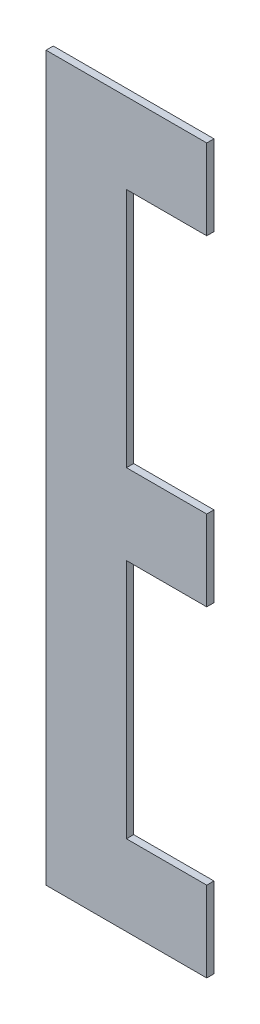
ISO-10303-21;
HEADER;
FILE_DESCRIPTION(('STEP AP214'),'2;1');
FILE_NAME('part.step','',(''),(''),'','','');
FILE_SCHEMA(('AUTOMOTIVE_DESIGN { 1 0 10303 214 1 1 1 1 }'));
ENDSEC;
DATA;
#1=APPLICATION_CONTEXT('core data for automotive mechanical design processes');
#2=APPLICATION_PROTOCOL_DEFINITION('international standard','automotive_design',2000,#1);
#3=PRODUCT_CONTEXT('',#1,'mechanical');
#4=PRODUCT('Part','Part','',(#3));
#5=PRODUCT_RELATED_PRODUCT_CATEGORY('part','',(#4));
#6=PRODUCT_DEFINITION_FORMATION('','',#4);
#7=PRODUCT_DEFINITION_CONTEXT('part definition',#1,'design');
#8=PRODUCT_DEFINITION('design','',#6,#7);
#9=PRODUCT_DEFINITION_SHAPE('','',#8);
#10=(LENGTH_UNIT() NAMED_UNIT(*) SI_UNIT(.MILLI.,.METRE.));
#11=(NAMED_UNIT(*) PLANE_ANGLE_UNIT() SI_UNIT($,.RADIAN.));
#12=(NAMED_UNIT(*) SI_UNIT($,.STERADIAN.) SOLID_ANGLE_UNIT());
#13=UNCERTAINTY_MEASURE_WITH_UNIT(LENGTH_MEASURE(1.E-05),#10,'distance_accuracy_value','');
#14=(GEOMETRIC_REPRESENTATION_CONTEXT(3) GLOBAL_UNCERTAINTY_ASSIGNED_CONTEXT((#13)) GLOBAL_UNIT_ASSIGNED_CONTEXT((#10,
#11,#12)) REPRESENTATION_CONTEXT('',''));
#15=CARTESIAN_POINT('',(0.,0.,0.));
#16=DIRECTION('',(0.,0.,1.));
#17=DIRECTION('',(1.,0.,0.));
#18=AXIS2_PLACEMENT_3D('',#15,#16,#17);
#19=CARTESIAN_POINT('',(0.,0.,0.05));
#20=DIRECTION('',(0.,0.,1.));
#21=DIRECTION('',(1.,0.,0.));
#22=AXIS2_PLACEMENT_3D('',#19,#20,#21);
#23=PLANE('',#22);
#24=DIRECTION('',(1.,0.,0.));
#25=VECTOR('',#24,1.);
#26=CARTESIAN_POINT('',(0.,2.5,0.05));
#27=LINE('',#26,#25);
#28=CARTESIAN_POINT('',(-1.389,2.5,0.05));
#29=VERTEX_POINT('',#28);
#30=CARTESIAN_POINT('',(-2.5,2.5,0.05));
#31=VERTEX_POINT('',#30);
#32=EDGE_CURVE('E141',#29,#31,#27,.F.);
#33=ORIENTED_EDGE('',*,*,#32,.T.);
#34=DIRECTION('',(0.,1.,0.));
#35=VECTOR('',#34,1.);
#36=CARTESIAN_POINT('',(-2.5,2.5,0.05));
#37=LINE('',#36,#35);
#38=CARTESIAN_POINT('',(-2.5,-2.5,0.05));
#39=VERTEX_POINT('',#38);
#40=EDGE_CURVE('E108',#39,#31,#37,.T.);
#41=ORIENTED_EDGE('',*,*,#40,.F.);
#42=DIRECTION('',(1.,0.,0.));
#43=VECTOR('',#42,1.);
#44=CARTESIAN_POINT('',(0.,-2.5,0.05));
#45=LINE('',#44,#43);
#46=CARTESIAN_POINT('',(-1.389,-2.5,0.05));
#47=VERTEX_POINT('',#46);
#48=EDGE_CURVE('E20',#39,#47,#45,.T.);
#49=ORIENTED_EDGE('',*,*,#48,.T.);
#50=DIRECTION('',(0.,1.,0.));
#51=VECTOR('',#50,1.);
#52=CARTESIAN_POINT('',(-1.389,0.,0.05));
#53=LINE('',#52,#51);
#54=CARTESIAN_POINT('',(-1.389,-1.944,0.05));
#55=VERTEX_POINT('',#54);
#56=EDGE_CURVE('E103',#47,#55,#53,.T.);
#57=ORIENTED_EDGE('',*,*,#56,.T.);
#58=DIRECTION('',(1.,0.,0.));
#59=VECTOR('',#58,1.);
#60=CARTESIAN_POINT('',(0.,-1.944,0.05));
#61=LINE('',#60,#59);
#62=CARTESIAN_POINT('',(-1.944,-1.944,0.05));
#63=VERTEX_POINT('',#62);
#64=EDGE_CURVE('E124',#55,#63,#61,.F.);
#65=ORIENTED_EDGE('',*,*,#64,.T.);
#66=DIRECTION('',(0.,1.,0.));
#67=VECTOR('',#66,1.);
#68=CARTESIAN_POINT('',(-1.944,0.,0.05));
#69=LINE('',#68,#67);
#70=CARTESIAN_POINT('',(-1.944,-0.278,0.05));
#71=VERTEX_POINT('',#70);
#72=EDGE_CURVE('E125',#63,#71,#69,.T.);
#73=ORIENTED_EDGE('',*,*,#72,.T.);
#74=DIRECTION('',(1.,0.,0.));
#75=VECTOR('',#74,1.);
#76=CARTESIAN_POINT('',(0.,-0.278,0.05));
#77=LINE('',#76,#75);
#78=CARTESIAN_POINT('',(-1.389,-0.278,0.05));
#79=VERTEX_POINT('',#78);
#80=EDGE_CURVE('E129',#71,#79,#77,.T.);
#81=ORIENTED_EDGE('',*,*,#80,.T.);
#82=DIRECTION('',(0.,1.,0.));
#83=VECTOR('',#82,1.);
#84=CARTESIAN_POINT('',(-1.389,0.,0.05));
#85=LINE('',#84,#83);
#86=CARTESIAN_POINT('',(-1.389,0.278,0.05));
#87=VERTEX_POINT('',#86);
#88=EDGE_CURVE('E131',#79,#87,#85,.T.);
#89=ORIENTED_EDGE('',*,*,#88,.T.);
#90=DIRECTION('',(1.,0.,0.));
#91=VECTOR('',#90,1.);
#92=CARTESIAN_POINT('',(0.,0.278,0.05));
#93=LINE('',#92,#91);
#94=CARTESIAN_POINT('',(-1.944,0.278,0.05));
#95=VERTEX_POINT('',#94);
#96=EDGE_CURVE('E133',#87,#95,#93,.F.);
#97=ORIENTED_EDGE('',*,*,#96,.T.);
#98=DIRECTION('',(0.,1.,0.));
#99=VECTOR('',#98,1.);
#100=CARTESIAN_POINT('',(-1.944,0.,0.05));
#101=LINE('',#100,#99);
#102=CARTESIAN_POINT('',(-1.944,1.944,0.05));
#103=VERTEX_POINT('',#102);
#104=EDGE_CURVE('E135',#95,#103,#101,.T.);
#105=ORIENTED_EDGE('',*,*,#104,.T.);
#106=DIRECTION('',(1.,0.,0.));
#107=VECTOR('',#106,1.);
#108=CARTESIAN_POINT('',(0.,1.944,0.05));
#109=LINE('',#108,#107);
#110=CARTESIAN_POINT('',(-1.389,1.944,0.05));
#111=VERTEX_POINT('',#110);
#112=EDGE_CURVE('E137',#103,#111,#109,.T.);
#113=ORIENTED_EDGE('',*,*,#112,.T.);
#114=DIRECTION('',(0.,1.,0.));
#115=VECTOR('',#114,1.);
#116=CARTESIAN_POINT('',(-1.389,0.,0.05));
#117=LINE('',#116,#115);
#118=EDGE_CURVE('E139',#111,#29,#117,.T.);
#119=ORIENTED_EDGE('',*,*,#118,.T.);
#120=EDGE_LOOP('',(#33,#41,#49,#57,#65,#73,#81,#89,#97,#105,#113,#119));
#121=FACE_BOUND('',#120,.T.);
#122=ADVANCED_FACE('F17',(#121),#23,.T.);
#123=CARTESIAN_POINT('',(-2.5,2.5,0.));
#124=DIRECTION('',(-1.,0.,0.));
#125=DIRECTION('',(0.,0.,1.));
#126=AXIS2_PLACEMENT_3D('',#123,#124,#125);
#127=PLANE('',#126);
#128=DIRECTION('',(0.,0.,1.));
#129=VECTOR('',#128,1.);
#130=CARTESIAN_POINT('',(-2.5,2.5,0.));
#131=LINE('',#130,#129);
#132=CARTESIAN_POINT('',(-2.5,2.5,0.));
#133=VERTEX_POINT('',#132);
#134=EDGE_CURVE('E160',#133,#31,#131,.T.);
#135=ORIENTED_EDGE('',*,*,#134,.F.);
#136=DIRECTION('',(0.,1.,0.));
#137=VECTOR('',#136,1.);
#138=CARTESIAN_POINT('',(-2.5,0.,0.));
#139=LINE('',#138,#137);
#140=CARTESIAN_POINT('',(-2.5,-2.5,0.));
#141=VERTEX_POINT('',#140);
#142=EDGE_CURVE('E164',#133,#141,#139,.F.);
#143=ORIENTED_EDGE('',*,*,#142,.T.);
#144=DIRECTION('',(0.,0.,-1.));
#145=VECTOR('',#144,1.);
#146=CARTESIAN_POINT('',(-2.5,-2.5,0.));
#147=LINE('',#146,#145);
#148=EDGE_CURVE('E120',#39,#141,#147,.T.);
#149=ORIENTED_EDGE('',*,*,#148,.F.);
#150=ORIENTED_EDGE('',*,*,#40,.T.);
#151=EDGE_LOOP('',(#135,#143,#149,#150));
#152=FACE_BOUND('',#151,.T.);
#153=ADVANCED_FACE('F234',(#152),#127,.T.);
#154=CARTESIAN_POINT('',(-2.5,-2.5,0.));
#155=DIRECTION('',(0.,-1.,0.));
#156=DIRECTION('',(0.,0.,-1.));
#157=AXIS2_PLACEMENT_3D('',#154,#155,#156);
#158=PLANE('',#157);
#159=ORIENTED_EDGE('',*,*,#148,.T.);
#160=DIRECTION('',(1.,0.,0.));
#161=VECTOR('',#160,1.);
#162=CARTESIAN_POINT('',(0.,-2.5,0.));
#163=LINE('',#162,#161);
#164=CARTESIAN_POINT('',(-1.389,-2.5,0.));
#165=VERTEX_POINT('',#164);
#166=EDGE_CURVE('E115',#141,#165,#163,.T.);
#167=ORIENTED_EDGE('',*,*,#166,.T.);
#168=DIRECTION('',(0.,0.,-1.));
#169=VECTOR('',#168,1.);
#170=CARTESIAN_POINT('',(-1.389,-2.5,0.));
#171=LINE('',#170,#169);
#172=EDGE_CURVE('E112',#47,#165,#171,.T.);
#173=ORIENTED_EDGE('',*,*,#172,.F.);
#174=ORIENTED_EDGE('',*,*,#48,.F.);
#175=EDGE_LOOP('',(#159,#167,#173,#174));
#176=FACE_BOUND('',#175,.T.);
#177=ADVANCED_FACE('F113',(#176),#158,.T.);
#178=CARTESIAN_POINT('',(-1.389,-2.5,0.));
#179=DIRECTION('',(1.,0.,0.));
#180=DIRECTION('',(0.,0.,-1.));
#181=AXIS2_PLACEMENT_3D('',#178,#179,#180);
#182=PLANE('',#181);
#183=ORIENTED_EDGE('',*,*,#172,.T.);
#184=DIRECTION('',(0.,1.,0.));
#185=VECTOR('',#184,1.);
#186=CARTESIAN_POINT('',(-1.389,0.,0.));
#187=LINE('',#186,#185);
#188=CARTESIAN_POINT('',(-1.389,-1.944,0.));
#189=VERTEX_POINT('',#188);
#190=EDGE_CURVE('E168',#165,#189,#187,.T.);
#191=ORIENTED_EDGE('',*,*,#190,.T.);
#192=DIRECTION('',(0.,0.,1.));
#193=VECTOR('',#192,1.);
#194=CARTESIAN_POINT('',(-1.389,-1.944,0.));
#195=LINE('',#194,#193);
#196=EDGE_CURVE('E119',#55,#189,#195,.F.);
#197=ORIENTED_EDGE('',*,*,#196,.F.);
#198=ORIENTED_EDGE('',*,*,#56,.F.);
#199=EDGE_LOOP('',(#183,#191,#197,#198));
#200=FACE_BOUND('',#199,.T.);
#201=ADVANCED_FACE('F122',(#200),#182,.T.);
#202=CARTESIAN_POINT('',(-1.389,-1.944,0.));
#203=DIRECTION('',(0.,1.,0.));
#204=DIRECTION('',(0.,0.,1.));
#205=AXIS2_PLACEMENT_3D('',#202,#203,#204);
#206=PLANE('',#205);
#207=ORIENTED_EDGE('',*,*,#196,.T.);
#208=DIRECTION('',(1.,0.,0.));
#209=VECTOR('',#208,1.);
#210=CARTESIAN_POINT('',(0.,-1.944,0.));
#211=LINE('',#210,#209);
#212=CARTESIAN_POINT('',(-1.944,-1.944,0.));
#213=VERTEX_POINT('',#212);
#214=EDGE_CURVE('E170',#189,#213,#211,.F.);
#215=ORIENTED_EDGE('',*,*,#214,.T.);
#216=DIRECTION('',(0.,0.,-1.));
#217=VECTOR('',#216,1.);
#218=CARTESIAN_POINT('',(-1.944,-1.944,0.));
#219=LINE('',#218,#217);
#220=EDGE_CURVE('E146',#63,#213,#219,.T.);
#221=ORIENTED_EDGE('',*,*,#220,.F.);
#222=ORIENTED_EDGE('',*,*,#64,.F.);
#223=EDGE_LOOP('',(#207,#215,#221,#222));
#224=FACE_BOUND('',#223,.T.);
#225=ADVANCED_FACE('F231',(#224),#206,.T.);
#226=CARTESIAN_POINT('',(-1.944,-1.944,0.));
#227=DIRECTION('',(1.,0.,0.));
#228=DIRECTION('',(0.,0.,-1.));
#229=AXIS2_PLACEMENT_3D('',#226,#227,#228);
#230=PLANE('',#229);
#231=ORIENTED_EDGE('',*,*,#220,.T.);
#232=DIRECTION('',(0.,1.,0.));
#233=VECTOR('',#232,1.);
#234=CARTESIAN_POINT('',(-1.944,0.,0.));
#235=LINE('',#234,#233);
#236=CARTESIAN_POINT('',(-1.944,-0.278,0.));
#237=VERTEX_POINT('',#236);
#238=EDGE_CURVE('E173',#213,#237,#235,.T.);
#239=ORIENTED_EDGE('',*,*,#238,.T.);
#240=DIRECTION('',(0.,0.,-1.));
#241=VECTOR('',#240,1.);
#242=CARTESIAN_POINT('',(-1.944,-0.278,0.));
#243=LINE('',#242,#241);
#244=EDGE_CURVE('E148',#71,#237,#243,.T.);
#245=ORIENTED_EDGE('',*,*,#244,.F.);
#246=ORIENTED_EDGE('',*,*,#72,.F.);
#247=EDGE_LOOP('',(#231,#239,#245,#246));
#248=FACE_BOUND('',#247,.T.);
#249=ADVANCED_FACE('F227',(#248),#230,.T.);
#250=CARTESIAN_POINT('',(-1.944,-0.278,0.));
#251=DIRECTION('',(0.,-1.,0.));
#252=DIRECTION('',(0.,0.,-1.));
#253=AXIS2_PLACEMENT_3D('',#250,#251,#252);
#254=PLANE('',#253);
#255=ORIENTED_EDGE('',*,*,#244,.T.);
#256=DIRECTION('',(1.,0.,0.));
#257=VECTOR('',#256,1.);
#258=CARTESIAN_POINT('',(0.,-0.278,0.));
#259=LINE('',#258,#257);
#260=CARTESIAN_POINT('',(-1.389,-0.278,0.));
#261=VERTEX_POINT('',#260);
#262=EDGE_CURVE('E176',#237,#261,#259,.T.);
#263=ORIENTED_EDGE('',*,*,#262,.T.);
#264=DIRECTION('',(0.,0.,-1.));
#265=VECTOR('',#264,1.);
#266=CARTESIAN_POINT('',(-1.389,-0.278,0.));
#267=LINE('',#266,#265);
#268=EDGE_CURVE('E150',#79,#261,#267,.T.);
#269=ORIENTED_EDGE('',*,*,#268,.F.);
#270=ORIENTED_EDGE('',*,*,#80,.F.);
#271=EDGE_LOOP('',(#255,#263,#269,#270));
#272=FACE_BOUND('',#271,.T.);
#273=ADVANCED_FACE('F222',(#272),#254,.T.);
#274=CARTESIAN_POINT('',(-1.389,-0.278,0.));
#275=DIRECTION('',(1.,0.,0.));
#276=DIRECTION('',(0.,0.,-1.));
#277=AXIS2_PLACEMENT_3D('',#274,#275,#276);
#278=PLANE('',#277);
#279=ORIENTED_EDGE('',*,*,#268,.T.);
#280=DIRECTION('',(0.,1.,0.));
#281=VECTOR('',#280,1.);
#282=CARTESIAN_POINT('',(-1.389,0.,0.));
#283=LINE('',#282,#281);
#284=CARTESIAN_POINT('',(-1.389,0.278,0.));
#285=VERTEX_POINT('',#284);
#286=EDGE_CURVE('E179',#261,#285,#283,.T.);
#287=ORIENTED_EDGE('',*,*,#286,.T.);
#288=DIRECTION('',(0.,0.,1.));
#289=VECTOR('',#288,1.);
#290=CARTESIAN_POINT('',(-1.389,0.278,0.));
#291=LINE('',#290,#289);
#292=EDGE_CURVE('E152',#87,#285,#291,.F.);
#293=ORIENTED_EDGE('',*,*,#292,.F.);
#294=ORIENTED_EDGE('',*,*,#88,.F.);
#295=EDGE_LOOP('',(#279,#287,#293,#294));
#296=FACE_BOUND('',#295,.T.);
#297=ADVANCED_FACE('F217',(#296),#278,.T.);
#298=CARTESIAN_POINT('',(-1.389,0.278,0.));
#299=DIRECTION('',(0.,1.,0.));
#300=DIRECTION('',(0.,0.,1.));
#301=AXIS2_PLACEMENT_3D('',#298,#299,#300);
#302=PLANE('',#301);
#303=ORIENTED_EDGE('',*,*,#292,.T.);
#304=DIRECTION('',(1.,0.,0.));
#305=VECTOR('',#304,1.);
#306=CARTESIAN_POINT('',(0.,0.278,0.));
#307=LINE('',#306,#305);
#308=CARTESIAN_POINT('',(-1.944,0.278,0.));
#309=VERTEX_POINT('',#308);
#310=EDGE_CURVE('E182',#285,#309,#307,.F.);
#311=ORIENTED_EDGE('',*,*,#310,.T.);
#312=DIRECTION('',(0.,0.,-1.));
#313=VECTOR('',#312,1.);
#314=CARTESIAN_POINT('',(-1.944,0.278,0.));
#315=LINE('',#314,#313);
#316=EDGE_CURVE('E154',#95,#309,#315,.T.);
#317=ORIENTED_EDGE('',*,*,#316,.F.);
#318=ORIENTED_EDGE('',*,*,#96,.F.);
#319=EDGE_LOOP('',(#303,#311,#317,#318));
#320=FACE_BOUND('',#319,.T.);
#321=ADVANCED_FACE('F212',(#320),#302,.T.);
#322=CARTESIAN_POINT('',(-1.944,0.278,0.));
#323=DIRECTION('',(1.,0.,0.));
#324=DIRECTION('',(0.,0.,-1.));
#325=AXIS2_PLACEMENT_3D('',#322,#323,#324);
#326=PLANE('',#325);
#327=ORIENTED_EDGE('',*,*,#316,.T.);
#328=DIRECTION('',(0.,1.,0.));
#329=VECTOR('',#328,1.);
#330=CARTESIAN_POINT('',(-1.944,0.,0.));
#331=LINE('',#330,#329);
#332=CARTESIAN_POINT('',(-1.944,1.944,0.));
#333=VERTEX_POINT('',#332);
#334=EDGE_CURVE('E185',#309,#333,#331,.T.);
#335=ORIENTED_EDGE('',*,*,#334,.T.);
#336=DIRECTION('',(0.,0.,-1.));
#337=VECTOR('',#336,1.);
#338=CARTESIAN_POINT('',(-1.944,1.944,0.));
#339=LINE('',#338,#337);
#340=EDGE_CURVE('E156',#103,#333,#339,.T.);
#341=ORIENTED_EDGE('',*,*,#340,.F.);
#342=ORIENTED_EDGE('',*,*,#104,.F.);
#343=EDGE_LOOP('',(#327,#335,#341,#342));
#344=FACE_BOUND('',#343,.T.);
#345=ADVANCED_FACE('F207',(#344),#326,.T.);
#346=CARTESIAN_POINT('',(-1.944,1.944,0.));
#347=DIRECTION('',(0.,-1.,0.));
#348=DIRECTION('',(0.,0.,-1.));
#349=AXIS2_PLACEMENT_3D('',#346,#347,#348);
#350=PLANE('',#349);
#351=ORIENTED_EDGE('',*,*,#340,.T.);
#352=DIRECTION('',(1.,0.,0.));
#353=VECTOR('',#352,1.);
#354=CARTESIAN_POINT('',(0.,1.944,0.));
#355=LINE('',#354,#353);
#356=CARTESIAN_POINT('',(-1.389,1.944,0.));
#357=VERTEX_POINT('',#356);
#358=EDGE_CURVE('E188',#333,#357,#355,.T.);
#359=ORIENTED_EDGE('',*,*,#358,.T.);
#360=DIRECTION('',(0.,0.,-1.));
#361=VECTOR('',#360,1.);
#362=CARTESIAN_POINT('',(-1.389,1.944,0.));
#363=LINE('',#362,#361);
#364=EDGE_CURVE('E158',#111,#357,#363,.T.);
#365=ORIENTED_EDGE('',*,*,#364,.F.);
#366=ORIENTED_EDGE('',*,*,#112,.F.);
#367=EDGE_LOOP('',(#351,#359,#365,#366));
#368=FACE_BOUND('',#367,.T.);
#369=ADVANCED_FACE('F202',(#368),#350,.T.);
#370=CARTESIAN_POINT('',(-1.389,1.944,0.));
#371=DIRECTION('',(1.,0.,0.));
#372=DIRECTION('',(0.,0.,-1.));
#373=AXIS2_PLACEMENT_3D('',#370,#371,#372);
#374=PLANE('',#373);
#375=ORIENTED_EDGE('',*,*,#364,.T.);
#376=DIRECTION('',(0.,1.,0.));
#377=VECTOR('',#376,1.);
#378=CARTESIAN_POINT('',(-1.389,0.,0.));
#379=LINE('',#378,#377);
#380=CARTESIAN_POINT('',(-1.389,2.5,0.));
#381=VERTEX_POINT('',#380);
#382=EDGE_CURVE('E26',#357,#381,#379,.T.);
#383=ORIENTED_EDGE('',*,*,#382,.T.);
#384=DIRECTION('',(0.,0.,1.));
#385=VECTOR('',#384,1.);
#386=CARTESIAN_POINT('',(-1.389,2.5,0.));
#387=LINE('',#386,#385);
#388=EDGE_CURVE('E34',#29,#381,#387,.F.);
#389=ORIENTED_EDGE('',*,*,#388,.F.);
#390=ORIENTED_EDGE('',*,*,#118,.F.);
#391=EDGE_LOOP('',(#375,#383,#389,#390));
#392=FACE_BOUND('',#391,.T.);
#393=ADVANCED_FACE('F194',(#392),#374,.T.);
#394=CARTESIAN_POINT('',(-1.389,2.5,0.));
#395=DIRECTION('',(0.,1.,0.));
#396=DIRECTION('',(0.,0.,1.));
#397=AXIS2_PLACEMENT_3D('',#394,#395,#396);
#398=PLANE('',#397);
#399=ORIENTED_EDGE('',*,*,#388,.T.);
#400=DIRECTION('',(1.,0.,0.));
#401=VECTOR('',#400,1.);
#402=CARTESIAN_POINT('',(0.,2.5,0.));
#403=LINE('',#402,#401);
#404=EDGE_CURVE('E11',#381,#133,#403,.F.);
#405=ORIENTED_EDGE('',*,*,#404,.T.);
#406=ORIENTED_EDGE('',*,*,#134,.T.);
#407=ORIENTED_EDGE('',*,*,#32,.F.);
#408=EDGE_LOOP('',(#399,#405,#406,#407));
#409=FACE_BOUND('',#408,.T.);
#410=ADVANCED_FACE('F235',(#409),#398,.T.);
#411=CARTESIAN_POINT('',(0.,0.,0.));
#412=DIRECTION('',(0.,0.,1.));
#413=DIRECTION('',(1.,0.,0.));
#414=AXIS2_PLACEMENT_3D('',#411,#412,#413);
#415=PLANE('',#414);
#416=ORIENTED_EDGE('',*,*,#382,.F.);
#417=ORIENTED_EDGE('',*,*,#358,.F.);
#418=ORIENTED_EDGE('',*,*,#334,.F.);
#419=ORIENTED_EDGE('',*,*,#310,.F.);
#420=ORIENTED_EDGE('',*,*,#286,.F.);
#421=ORIENTED_EDGE('',*,*,#262,.F.);
#422=ORIENTED_EDGE('',*,*,#238,.F.);
#423=ORIENTED_EDGE('',*,*,#214,.F.);
#424=ORIENTED_EDGE('',*,*,#190,.F.);
#425=ORIENTED_EDGE('',*,*,#166,.F.);
#426=ORIENTED_EDGE('',*,*,#142,.F.);
#427=ORIENTED_EDGE('',*,*,#404,.F.);
#428=EDGE_LOOP('',(#416,#417,#418,#419,#420,#421,#422,#423,#424,#425,#426,#427));
#429=FACE_BOUND('',#428,.T.);
#430=ADVANCED_FACE('F199',(#429),#415,.F.);
#431=CLOSED_SHELL('',(#122,#153,#177,#201,#225,#249,#273,#297,#321,#345,#369,#393,#410,#430));
#432=MANIFOLD_SOLID_BREP('B1',#431);
#433=ADVANCED_BREP_SHAPE_REPRESENTATION('',(#18,#432),#14);
#434=SHAPE_DEFINITION_REPRESENTATION(#9,#433);
ENDSEC;
END-ISO-10303-21;
